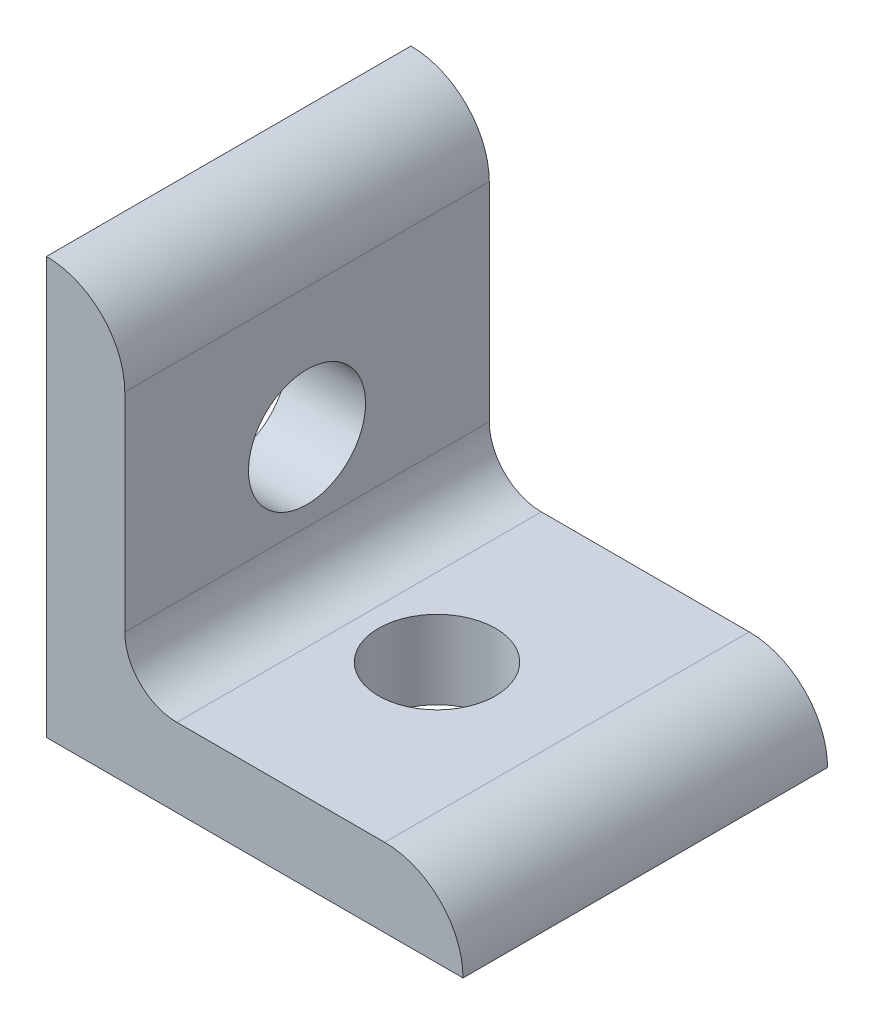
ISO-10303-21;
HEADER;
FILE_DESCRIPTION(('STEP AP214'),'2;1');
FILE_NAME('part.step','',(''),(''),'','','');
FILE_SCHEMA(('AUTOMOTIVE_DESIGN { 1 0 10303 214 1 1 1 1 }'));
ENDSEC;
DATA;
#1=APPLICATION_CONTEXT('core data for automotive mechanical design processes');
#2=APPLICATION_PROTOCOL_DEFINITION('international standard','automotive_design',2000,#1);
#3=PRODUCT_CONTEXT('',#1,'mechanical');
#4=PRODUCT('Part','Part','',(#3));
#5=PRODUCT_RELATED_PRODUCT_CATEGORY('part','',(#4));
#6=PRODUCT_DEFINITION_FORMATION('','',#4);
#7=PRODUCT_DEFINITION_CONTEXT('part definition',#1,'design');
#8=PRODUCT_DEFINITION('design','',#6,#7);
#9=PRODUCT_DEFINITION_SHAPE('','',#8);
#10=(LENGTH_UNIT() NAMED_UNIT(*) SI_UNIT(.MILLI.,.METRE.));
#11=(NAMED_UNIT(*) PLANE_ANGLE_UNIT() SI_UNIT($,.RADIAN.));
#12=(NAMED_UNIT(*) SI_UNIT($,.STERADIAN.) SOLID_ANGLE_UNIT());
#13=UNCERTAINTY_MEASURE_WITH_UNIT(LENGTH_MEASURE(1.E-05),#10,'distance_accuracy_value','');
#14=(GEOMETRIC_REPRESENTATION_CONTEXT(3) GLOBAL_UNCERTAINTY_ASSIGNED_CONTEXT((#13)) GLOBAL_UNIT_ASSIGNED_CONTEXT((#10,
#11,#12)) REPRESENTATION_CONTEXT('',''));
#15=CARTESIAN_POINT('',(0.,0.,0.));
#16=DIRECTION('',(0.,0.,1.));
#17=DIRECTION('',(1.,0.,0.));
#18=AXIS2_PLACEMENT_3D('',#15,#16,#17);
#19=CARTESIAN_POINT('',(4.7752,20.6248,11.1125));
#20=DIRECTION('',(-1.,0.,0.));
#21=DIRECTION('',(0.,-1.,0.));
#22=AXIS2_PLACEMENT_3D('',#19,#20,#21);
#23=PLANE('',#22);
#24=DIRECTION('',(0.,1.,0.));
#25=VECTOR('',#24,1.);
#26=CARTESIAN_POINT('',(4.7752,20.6248,-11.1125));
#27=LINE('',#26,#25);
#28=CARTESIAN_POINT('',(4.7752,7.9502,-11.1125));
#29=VERTEX_POINT('',#28);
#30=CARTESIAN_POINT('',(4.7752,20.6248,-11.1125));
#31=VERTEX_POINT('',#30);
#32=EDGE_CURVE('E117',#29,#31,#27,.T.);
#33=ORIENTED_EDGE('',*,*,#32,.T.);
#34=DIRECTION('',(0.,0.,-1.));
#35=VECTOR('',#34,1.);
#36=CARTESIAN_POINT('',(4.7752,20.6248,11.1125));
#37=LINE('',#36,#35);
#38=CARTESIAN_POINT('',(4.7752,20.6248,11.1125));
#39=VERTEX_POINT('',#38);
#40=EDGE_CURVE('E114',#39,#31,#37,.T.);
#41=ORIENTED_EDGE('',*,*,#40,.F.);
#42=DIRECTION('',(0.,1.,0.));
#43=VECTOR('',#42,1.);
#44=CARTESIAN_POINT('',(4.7752,20.6248,11.1125));
#45=LINE('',#44,#43);
#46=CARTESIAN_POINT('',(4.7752,7.9502,11.1125));
#47=VERTEX_POINT('',#46);
#48=EDGE_CURVE('E103',#47,#39,#45,.T.);
#49=ORIENTED_EDGE('',*,*,#48,.F.);
#50=DIRECTION('',(0.,0.,-1.));
#51=VECTOR('',#50,1.);
#52=CARTESIAN_POINT('',(4.7752,7.9502,11.1125));
#53=LINE('',#52,#51);
#54=EDGE_CURVE('E118',#47,#29,#53,.T.);
#55=ORIENTED_EDGE('',*,*,#54,.T.);
#56=EDGE_LOOP('',(#33,#41,#49,#55));
#57=FACE_BOUND('',#56,.T.);
#58=CARTESIAN_POINT('',(4.7752,12.7,0.));
#59=DIRECTION('',(-1.,0.,0.));
#60=DIRECTION('',(0.,-1.,0.));
#61=AXIS2_PLACEMENT_3D('',#58,#59,#60);
#62=CIRCLE('',#61,3.5687);
#63=CARTESIAN_POINT('',(4.7752,9.1313,0.));
#64=VERTEX_POINT('',#63);
#65=EDGE_CURVE('E167',#64,#64,#62,.F.);
#66=ORIENTED_EDGE('',*,*,#65,.F.);
#67=EDGE_LOOP('',(#66));
#68=FACE_BOUND('',#67,.T.);
#69=ADVANCED_FACE('F35',(#57,#68),#23,.F.);
#70=CARTESIAN_POINT('',(0.,0.,11.1125));
#71=DIRECTION('',(1.,0.,0.));
#72=DIRECTION('',(0.,0.,-1.));
#73=AXIS2_PLACEMENT_3D('',#70,#71,#72);
#74=PLANE('',#73);
#75=DIRECTION('',(0.,-1.,0.));
#76=VECTOR('',#75,1.);
#77=CARTESIAN_POINT('',(0.,0.,-11.1125));
#78=LINE('',#77,#76);
#79=CARTESIAN_POINT('',(0.,25.4,-11.1125));
#80=VERTEX_POINT('',#79);
#81=CARTESIAN_POINT('',(0.,0.,-11.1125));
#82=VERTEX_POINT('',#81);
#83=EDGE_CURVE('E85',#80,#82,#78,.T.);
#84=ORIENTED_EDGE('',*,*,#83,.T.);
#85=DIRECTION('',(0.,0.,-1.));
#86=VECTOR('',#85,1.);
#87=CARTESIAN_POINT('',(0.,0.,11.1125));
#88=LINE('',#87,#86);
#89=CARTESIAN_POINT('',(0.,0.,11.1125));
#90=VERTEX_POINT('',#89);
#91=EDGE_CURVE('E123',#90,#82,#88,.T.);
#92=ORIENTED_EDGE('',*,*,#91,.F.);
#93=DIRECTION('',(0.,-1.,0.));
#94=VECTOR('',#93,1.);
#95=CARTESIAN_POINT('',(0.,0.,11.1125));
#96=LINE('',#95,#94);
#97=CARTESIAN_POINT('',(0.,25.4,11.1125));
#98=VERTEX_POINT('',#97);
#99=EDGE_CURVE('E53',#98,#90,#96,.T.);
#100=ORIENTED_EDGE('',*,*,#99,.F.);
#101=DIRECTION('',(0.,0.,-1.));
#102=VECTOR('',#101,1.);
#103=CARTESIAN_POINT('',(0.,25.4,11.1125));
#104=LINE('',#103,#102);
#105=EDGE_CURVE('E119',#98,#80,#104,.T.);
#106=ORIENTED_EDGE('',*,*,#105,.T.);
#107=EDGE_LOOP('',(#84,#92,#100,#106));
#108=FACE_BOUND('',#107,.T.);
#109=CARTESIAN_POINT('',(0.,12.7,0.));
#110=DIRECTION('',(1.,0.,0.));
#111=DIRECTION('',(0.,0.,-1.));
#112=AXIS2_PLACEMENT_3D('',#109,#110,#111);
#113=CIRCLE('',#112,3.5687);
#114=CARTESIAN_POINT('',(0.,12.7,-3.5687));
#115=VERTEX_POINT('',#114);
#116=EDGE_CURVE('E170',#115,#115,#113,.T.);
#117=ORIENTED_EDGE('',*,*,#116,.T.);
#118=EDGE_LOOP('',(#117));
#119=FACE_BOUND('',#118,.T.);
#120=ADVANCED_FACE('F174',(#108,#119),#74,.F.);
#121=CARTESIAN_POINT('',(25.4,0.,11.1125));
#122=DIRECTION('',(0.,1.,0.));
#123=DIRECTION('',(-1.,0.,0.));
#124=AXIS2_PLACEMENT_3D('',#121,#122,#123);
#125=PLANE('',#124);
#126=DIRECTION('',(1.,0.,0.));
#127=VECTOR('',#126,1.);
#128=CARTESIAN_POINT('',(25.4,0.,-11.1125));
#129=LINE('',#128,#127);
#130=CARTESIAN_POINT('',(25.4,0.,-11.1125));
#131=VERTEX_POINT('',#130);
#132=EDGE_CURVE('E127',#82,#131,#129,.T.);
#133=ORIENTED_EDGE('',*,*,#132,.T.);
#134=DIRECTION('',(0.,0.,-1.));
#135=VECTOR('',#134,1.);
#136=CARTESIAN_POINT('',(25.4,0.,11.1125));
#137=LINE('',#136,#135);
#138=CARTESIAN_POINT('',(25.4,0.,11.1125));
#139=VERTEX_POINT('',#138);
#140=EDGE_CURVE('E11',#139,#131,#137,.T.);
#141=ORIENTED_EDGE('',*,*,#140,.F.);
#142=DIRECTION('',(1.,0.,0.));
#143=VECTOR('',#142,1.);
#144=CARTESIAN_POINT('',(25.4,0.,11.1125));
#145=LINE('',#144,#143);
#146=EDGE_CURVE('E139',#90,#139,#145,.T.);
#147=ORIENTED_EDGE('',*,*,#146,.F.);
#148=ORIENTED_EDGE('',*,*,#91,.T.);
#149=EDGE_LOOP('',(#133,#141,#147,#148));
#150=FACE_BOUND('',#149,.T.);
#151=CARTESIAN_POINT('',(12.7,0.,0.));
#152=DIRECTION('',(0.,1.,0.));
#153=DIRECTION('',(0.,0.,1.));
#154=AXIS2_PLACEMENT_3D('',#151,#152,#153);
#155=CIRCLE('',#154,3.5687);
#156=CARTESIAN_POINT('',(12.7,0.,-3.5687));
#157=VERTEX_POINT('',#156);
#158=EDGE_CURVE('E164',#157,#157,#155,.T.);
#159=ORIENTED_EDGE('',*,*,#158,.T.);
#160=EDGE_LOOP('',(#159));
#161=FACE_BOUND('',#160,.T.);
#162=ADVANCED_FACE('F37',(#150,#161),#125,.F.);
#163=CARTESIAN_POINT('',(7.9502,4.7752,11.1125));
#164=DIRECTION('',(0.,-1.,0.));
#165=DIRECTION('',(0.,0.,-1.));
#166=AXIS2_PLACEMENT_3D('',#163,#164,#165);
#167=PLANE('',#166);
#168=DIRECTION('',(-1.,0.,0.));
#169=VECTOR('',#168,1.);
#170=CARTESIAN_POINT('',(7.9502,4.7752,-11.1125));
#171=LINE('',#170,#169);
#172=CARTESIAN_POINT('',(20.6248,4.7752,-11.1125));
#173=VERTEX_POINT('',#172);
#174=CARTESIAN_POINT('',(7.9502,4.7752,-11.1125));
#175=VERTEX_POINT('',#174);
#176=EDGE_CURVE('E132',#173,#175,#171,.T.);
#177=ORIENTED_EDGE('',*,*,#176,.T.);
#178=DIRECTION('',(0.,0.,-1.));
#179=VECTOR('',#178,1.);
#180=CARTESIAN_POINT('',(7.9502,4.7752,11.1125));
#181=LINE('',#180,#179);
#182=CARTESIAN_POINT('',(7.9502,4.7752,11.1125));
#183=VERTEX_POINT('',#182);
#184=EDGE_CURVE('E143',#183,#175,#181,.T.);
#185=ORIENTED_EDGE('',*,*,#184,.F.);
#186=DIRECTION('',(-1.,0.,0.));
#187=VECTOR('',#186,1.);
#188=CARTESIAN_POINT('',(7.9502,4.7752,11.1125));
#189=LINE('',#188,#187);
#190=CARTESIAN_POINT('',(20.6248,4.7752,11.1125));
#191=VERTEX_POINT('',#190);
#192=EDGE_CURVE('E153',#191,#183,#189,.T.);
#193=ORIENTED_EDGE('',*,*,#192,.F.);
#194=DIRECTION('',(0.,0.,-1.));
#195=VECTOR('',#194,1.);
#196=CARTESIAN_POINT('',(20.6248,4.7752,11.1125));
#197=LINE('',#196,#195);
#198=EDGE_CURVE('E45',#191,#173,#197,.T.);
#199=ORIENTED_EDGE('',*,*,#198,.T.);
#200=EDGE_LOOP('',(#177,#185,#193,#199));
#201=FACE_BOUND('',#200,.T.);
#202=CARTESIAN_POINT('',(12.7,4.7752,0.));
#203=DIRECTION('',(0.,-1.,0.));
#204=DIRECTION('',(0.,0.,-1.));
#205=AXIS2_PLACEMENT_3D('',#202,#203,#204);
#206=CIRCLE('',#205,3.5687);
#207=CARTESIAN_POINT('',(12.7,4.7752,-3.5687));
#208=VERTEX_POINT('',#207);
#209=EDGE_CURVE('E39',#208,#208,#206,.F.);
#210=ORIENTED_EDGE('',*,*,#209,.F.);
#211=EDGE_LOOP('',(#210));
#212=FACE_BOUND('',#211,.T.);
#213=ADVANCED_FACE('F150',(#201,#212),#167,.F.);
#214=CARTESIAN_POINT('',(20.6248,0.,11.1125));
#215=DIRECTION('',(0.,0.,-1.));
#216=DIRECTION('',(-1.,0.,0.));
#217=AXIS2_PLACEMENT_3D('',#214,#215,#216);
#218=CYLINDRICAL_SURFACE('',#217,4.7752);
#219=CARTESIAN_POINT('',(20.6248,0.,-11.1125));
#220=DIRECTION('',(0.,0.,1.));
#221=DIRECTION('',(1.,0.,0.));
#222=AXIS2_PLACEMENT_3D('',#219,#220,#221);
#223=CIRCLE('',#222,4.7752);
#224=EDGE_CURVE('E130',#131,#173,#223,.T.);
#225=ORIENTED_EDGE('',*,*,#224,.T.);
#226=ORIENTED_EDGE('',*,*,#198,.F.);
#227=CARTESIAN_POINT('',(20.6248,0.,11.1125));
#228=DIRECTION('',(0.,0.,1.));
#229=DIRECTION('',(1.,0.,0.));
#230=AXIS2_PLACEMENT_3D('',#227,#228,#229);
#231=CIRCLE('',#230,4.7752);
#232=EDGE_CURVE('E93',#139,#191,#231,.T.);
#233=ORIENTED_EDGE('',*,*,#232,.F.);
#234=ORIENTED_EDGE('',*,*,#140,.T.);
#235=EDGE_LOOP('',(#225,#226,#233,#234));
#236=FACE_BOUND('',#235,.T.);
#237=ADVANCED_FACE('F192',(#236),#218,.T.);
#238=CARTESIAN_POINT('',(7.9502,7.9502,11.1125));
#239=DIRECTION('',(0.,0.,-1.));
#240=DIRECTION('',(-1.,0.,0.));
#241=AXIS2_PLACEMENT_3D('',#238,#239,#240);
#242=CYLINDRICAL_SURFACE('',#241,3.175);
#243=CARTESIAN_POINT('',(7.9502,7.9502,-11.1125));
#244=DIRECTION('',(0.,0.,-1.));
#245=DIRECTION('',(1.,0.,0.));
#246=AXIS2_PLACEMENT_3D('',#243,#244,#245);
#247=CIRCLE('',#246,3.175);
#248=EDGE_CURVE('E134',#175,#29,#247,.T.);
#249=ORIENTED_EDGE('',*,*,#248,.T.);
#250=ORIENTED_EDGE('',*,*,#54,.F.);
#251=CARTESIAN_POINT('',(7.9502,7.9502,11.1125));
#252=DIRECTION('',(0.,0.,-1.));
#253=DIRECTION('',(1.,0.,0.));
#254=AXIS2_PLACEMENT_3D('',#251,#252,#253);
#255=CIRCLE('',#254,3.175);
#256=EDGE_CURVE('E109',#183,#47,#255,.T.);
#257=ORIENTED_EDGE('',*,*,#256,.F.);
#258=ORIENTED_EDGE('',*,*,#184,.T.);
#259=EDGE_LOOP('',(#249,#250,#257,#258));
#260=FACE_BOUND('',#259,.T.);
#261=ADVANCED_FACE('F159',(#260),#242,.F.);
#262=CARTESIAN_POINT('',(0.,20.6248,11.1125));
#263=DIRECTION('',(0.,0.,-1.));
#264=DIRECTION('',(-1.,0.,0.));
#265=AXIS2_PLACEMENT_3D('',#262,#263,#264);
#266=CYLINDRICAL_SURFACE('',#265,4.7752);
#267=CARTESIAN_POINT('',(0.,20.6248,-11.1125));
#268=DIRECTION('',(0.,0.,1.));
#269=DIRECTION('',(1.,0.,0.));
#270=AXIS2_PLACEMENT_3D('',#267,#268,#269);
#271=CIRCLE('',#270,4.7752);
#272=EDGE_CURVE('E79',#31,#80,#271,.T.);
#273=ORIENTED_EDGE('',*,*,#272,.T.);
#274=ORIENTED_EDGE('',*,*,#105,.F.);
#275=CARTESIAN_POINT('',(0.,20.6248,11.1125));
#276=DIRECTION('',(0.,0.,1.));
#277=DIRECTION('',(1.,0.,0.));
#278=AXIS2_PLACEMENT_3D('',#275,#276,#277);
#279=CIRCLE('',#278,4.7752);
#280=EDGE_CURVE('E107',#39,#98,#279,.T.);
#281=ORIENTED_EDGE('',*,*,#280,.F.);
#282=ORIENTED_EDGE('',*,*,#40,.T.);
#283=EDGE_LOOP('',(#273,#274,#281,#282));
#284=FACE_BOUND('',#283,.T.);
#285=ADVANCED_FACE('F121',(#284),#266,.T.);
#286=CARTESIAN_POINT('',(0.,20.6248,11.1125));
#287=DIRECTION('',(0.,0.,1.));
#288=DIRECTION('',(1.,0.,0.));
#289=AXIS2_PLACEMENT_3D('',#286,#287,#288);
#290=PLANE('',#289);
#291=ORIENTED_EDGE('',*,*,#146,.T.);
#292=ORIENTED_EDGE('',*,*,#232,.T.);
#293=ORIENTED_EDGE('',*,*,#192,.T.);
#294=ORIENTED_EDGE('',*,*,#256,.T.);
#295=ORIENTED_EDGE('',*,*,#48,.T.);
#296=ORIENTED_EDGE('',*,*,#280,.T.);
#297=ORIENTED_EDGE('',*,*,#99,.T.);
#298=EDGE_LOOP('',(#291,#292,#293,#294,#295,#296,#297));
#299=FACE_BOUND('',#298,.T.);
#300=ADVANCED_FACE('F105',(#299),#290,.T.);
#301=CARTESIAN_POINT('',(0.,20.6248,-11.1125));
#302=DIRECTION('',(0.,0.,1.));
#303=DIRECTION('',(1.,0.,0.));
#304=AXIS2_PLACEMENT_3D('',#301,#302,#303);
#305=PLANE('',#304);
#306=ORIENTED_EDGE('',*,*,#132,.F.);
#307=ORIENTED_EDGE('',*,*,#83,.F.);
#308=ORIENTED_EDGE('',*,*,#272,.F.);
#309=ORIENTED_EDGE('',*,*,#32,.F.);
#310=ORIENTED_EDGE('',*,*,#248,.F.);
#311=ORIENTED_EDGE('',*,*,#176,.F.);
#312=ORIENTED_EDGE('',*,*,#224,.F.);
#313=EDGE_LOOP('',(#306,#307,#308,#309,#310,#311,#312));
#314=FACE_BOUND('',#313,.T.);
#315=ADVANCED_FACE('F157',(#314),#305,.F.);
#316=CARTESIAN_POINT('',(12.7,25.4,0.));
#317=DIRECTION('',(0.,-1.,0.));
#318=DIRECTION('',(0.,0.,-1.));
#319=AXIS2_PLACEMENT_3D('',#316,#317,#318);
#320=CYLINDRICAL_SURFACE('',#319,3.5687);
#321=CARTESIAN_POINT('',(12.7,0.,-3.5687));
#322=CARTESIAN_POINT('',(12.7,0.0497416666666665,-3.5687));
#323=CARTESIAN_POINT('',(12.7,0.0994833333333329,-3.5687));
#324=CARTESIAN_POINT('',(12.7,0.198966666666666,-3.5687));
#325=CARTESIAN_POINT('',(12.7,0.248708333333332,-3.5687));
#326=CARTESIAN_POINT('',(12.7,0.348191666666666,-3.5687));
#327=CARTESIAN_POINT('',(12.7,0.397933333333334,-3.5687));
#328=CARTESIAN_POINT('',(12.7,0.497416666666668,-3.5687));
#329=CARTESIAN_POINT('',(12.7,0.547158333333334,-3.5687));
#330=CARTESIAN_POINT('',(12.7,0.646641666666667,-3.5687));
#331=CARTESIAN_POINT('',(12.7,0.696383333333334,-3.5687));
#332=CARTESIAN_POINT('',(12.7,0.795866666666667,-3.5687));
#333=CARTESIAN_POINT('',(12.7,0.845608333333333,-3.5687));
#334=CARTESIAN_POINT('',(12.7,0.945091666666666,-3.5687));
#335=CARTESIAN_POINT('',(12.7,0.994833333333333,-3.5687));
#336=CARTESIAN_POINT('',(12.7,1.09431666666667,-3.5687));
#337=CARTESIAN_POINT('',(12.7,1.14405833333333,-3.5687));
#338=CARTESIAN_POINT('',(12.7,1.24354166666667,-3.5687));
#339=CARTESIAN_POINT('',(12.7,1.29328333333333,-3.5687));
#340=CARTESIAN_POINT('',(12.7,1.39276666666667,-3.5687));
#341=CARTESIAN_POINT('',(12.7,1.44250833333333,-3.5687));
#342=CARTESIAN_POINT('',(12.7,1.54199166666667,-3.5687));
#343=CARTESIAN_POINT('',(12.7,1.59173333333333,-3.5687));
#344=CARTESIAN_POINT('',(12.7,1.69121666666667,-3.5687));
#345=CARTESIAN_POINT('',(12.7,1.74095833333333,-3.5687));
#346=CARTESIAN_POINT('',(12.7,1.84044166666667,-3.5687));
#347=CARTESIAN_POINT('',(12.7,1.89018333333333,-3.5687));
#348=CARTESIAN_POINT('',(12.7,1.98966666666667,-3.5687));
#349=CARTESIAN_POINT('',(12.7,2.03940833333333,-3.5687));
#350=CARTESIAN_POINT('',(12.7,2.13889166666667,-3.5687));
#351=CARTESIAN_POINT('',(12.7,2.18863333333333,-3.5687));
#352=CARTESIAN_POINT('',(12.7,2.28811666666667,-3.5687));
#353=CARTESIAN_POINT('',(12.7,2.33785833333333,-3.5687));
#354=CARTESIAN_POINT('',(12.7,2.43734166666667,-3.5687));
#355=CARTESIAN_POINT('',(12.7,2.48708333333333,-3.5687));
#356=CARTESIAN_POINT('',(12.7,2.58656666666667,-3.5687));
#357=CARTESIAN_POINT('',(12.7,2.63630833333333,-3.5687));
#358=CARTESIAN_POINT('',(12.7,2.73579166666667,-3.5687));
#359=CARTESIAN_POINT('',(12.7,2.78553333333333,-3.5687));
#360=CARTESIAN_POINT('',(12.7,2.88501666666667,-3.5687));
#361=CARTESIAN_POINT('',(12.7,2.93475833333333,-3.5687));
#362=CARTESIAN_POINT('',(12.7,3.03424166666667,-3.5687));
#363=CARTESIAN_POINT('',(12.7,3.08398333333333,-3.5687));
#364=CARTESIAN_POINT('',(12.7,3.18346666666667,-3.5687));
#365=CARTESIAN_POINT('',(12.7,3.23320833333333,-3.5687));
#366=CARTESIAN_POINT('',(12.7,3.33269166666667,-3.5687));
#367=CARTESIAN_POINT('',(12.7,3.38243333333333,-3.5687));
#368=CARTESIAN_POINT('',(12.7,3.48191666666667,-3.5687));
#369=CARTESIAN_POINT('',(12.7,3.53165833333333,-3.5687));
#370=CARTESIAN_POINT('',(12.7,3.63114166666667,-3.5687));
#371=CARTESIAN_POINT('',(12.7,3.68088333333333,-3.5687));
#372=CARTESIAN_POINT('',(12.7,3.78036666666667,-3.5687));
#373=CARTESIAN_POINT('',(12.7,3.83010833333333,-3.5687));
#374=CARTESIAN_POINT('',(12.7,3.92959166666667,-3.5687));
#375=CARTESIAN_POINT('',(12.7,3.97933333333333,-3.5687));
#376=CARTESIAN_POINT('',(12.7,4.07881666666667,-3.5687));
#377=CARTESIAN_POINT('',(12.7,4.12855833333333,-3.5687));
#378=CARTESIAN_POINT('',(12.7,4.22804166666667,-3.5687));
#379=CARTESIAN_POINT('',(12.7,4.27778333333333,-3.5687));
#380=CARTESIAN_POINT('',(12.7,4.37726666666667,-3.5687));
#381=CARTESIAN_POINT('',(12.7,4.42700833333333,-3.5687));
#382=CARTESIAN_POINT('',(12.7,4.52649166666667,-3.5687));
#383=CARTESIAN_POINT('',(12.7,4.57623333333333,-3.5687));
#384=CARTESIAN_POINT('',(12.7,4.67571666666667,-3.5687));
#385=CARTESIAN_POINT('',(12.7,4.72545833333333,-3.5687));
#386=CARTESIAN_POINT('',(12.7,4.7752,-3.5687));
#387=B_SPLINE_CURVE_WITH_KNOTS('',3,(#321,#322,#323,#324,#325,#326,#327,#328,#329,#330,#331,
#332,#333,#334,#335,#336,#337,#338,#339,#340,#341,#342,#343,#344,#345,#346,#347,#348,#349,#350,
#351,#352,#353,#354,#355,#356,#357,#358,#359,#360,#361,#362,#363,#364,#365,#366,#367,#368,#369,
#370,#371,#372,#373,#374,#375,#376,#377,#378,#379,#380,#381,#382,#383,#384,#385,#386),
.UNSPECIFIED.,.F.,.F.,(4,2,2,2,2,2,2,2,2,2,2,2,2,2,2,2,2,2,2,2,2,2,2,2,2,2,2,2,2,2,2,2,4),(0.,
0.149224999999999,0.298449999999999,0.447675000000002,0.596900000000001,0.746125,0.89535,
1.044575,1.1938,1.343025,1.49225,1.641475,1.7907,1.939925,2.08915,2.238375,2.3876,2.536825,
2.68605,2.835275,2.9845,3.133725,3.28295,3.432175,3.5814,3.730625,3.87985,4.029075,4.1783,
4.327525,4.47675,4.625975,4.7752),.UNSPECIFIED.);
#388=EDGE_CURVE('BSEAM179',#157,#208,#387,.T.);
#389=ORIENTED_EDGE('',*,*,#158,.F.);
#390=ORIENTED_EDGE('',*,*,#209,.T.);
#391=ORIENTED_EDGE('',*,*,#388,.T.);
#392=ORIENTED_EDGE('',*,*,#388,.F.);
#393=EDGE_LOOP('',(#389,#391,#390,#392));
#394=FACE_BOUND('',#393,.T.);
#395=ADVANCED_FACE('F179',(#394),#320,.F.);
#396=CARTESIAN_POINT('',(25.4,12.7,0.));
#397=DIRECTION('',(-1.,0.,0.));
#398=DIRECTION('',(0.,0.,1.));
#399=AXIS2_PLACEMENT_3D('',#396,#397,#398);
#400=CYLINDRICAL_SURFACE('',#399,3.5687);
#401=ORIENTED_EDGE('',*,*,#116,.F.);
#402=EDGE_LOOP('',(#401));
#403=FACE_BOUND('',#402,.T.);
#404=ORIENTED_EDGE('',*,*,#65,.T.);
#405=EDGE_LOOP('',(#404));
#406=FACE_BOUND('',#405,.T.);
#407=ADVANCED_FACE('F176',(#403,#406),#400,.F.);
#408=CLOSED_SHELL('',(#69,#120,#162,#213,#237,#261,#285,#300,#315,#395,#407));
#409=MANIFOLD_SOLID_BREP('B2',#408);
#410=ADVANCED_BREP_SHAPE_REPRESENTATION('',(#18,#409),#14);
#411=SHAPE_DEFINITION_REPRESENTATION(#9,#410);
ENDSEC;
END-ISO-10303-21;
